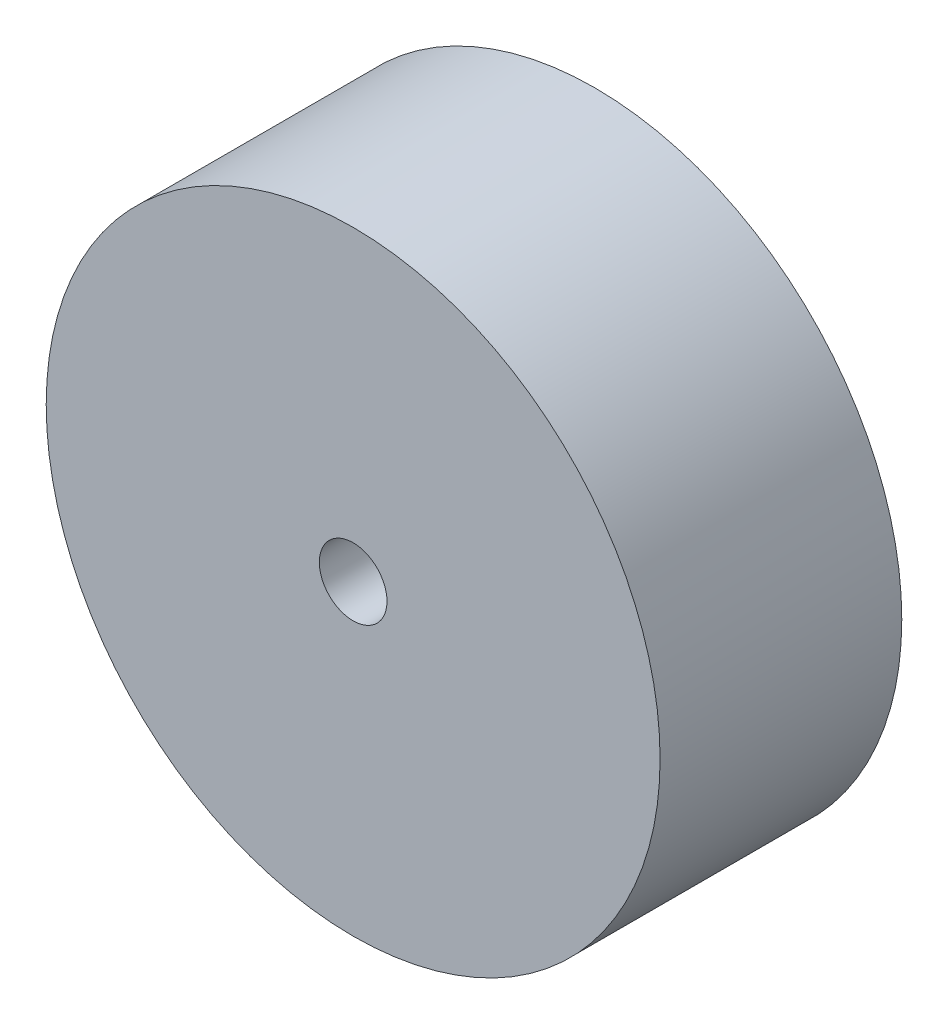
ISO-10303-21;
HEADER;
FILE_DESCRIPTION(('STEP AP214'),'2;1');
FILE_NAME('part.step','',(''),(''),'','','');
FILE_SCHEMA(('AUTOMOTIVE_DESIGN { 1 0 10303 214 1 1 1 1 }'));
ENDSEC;
DATA;
#1=APPLICATION_CONTEXT('core data for automotive mechanical design processes');
#2=APPLICATION_PROTOCOL_DEFINITION('international standard','automotive_design',2000,#1);
#3=PRODUCT_CONTEXT('',#1,'mechanical');
#4=PRODUCT('Part','Part','',(#3));
#5=PRODUCT_RELATED_PRODUCT_CATEGORY('part','',(#4));
#6=PRODUCT_DEFINITION_FORMATION('','',#4);
#7=PRODUCT_DEFINITION_CONTEXT('part definition',#1,'design');
#8=PRODUCT_DEFINITION('design','',#6,#7);
#9=PRODUCT_DEFINITION_SHAPE('','',#8);
#10=(LENGTH_UNIT() NAMED_UNIT(*) SI_UNIT(.MILLI.,.METRE.));
#11=(NAMED_UNIT(*) PLANE_ANGLE_UNIT() SI_UNIT($,.RADIAN.));
#12=(NAMED_UNIT(*) SI_UNIT($,.STERADIAN.) SOLID_ANGLE_UNIT());
#13=UNCERTAINTY_MEASURE_WITH_UNIT(LENGTH_MEASURE(1.E-05),#10,'distance_accuracy_value','');
#14=(GEOMETRIC_REPRESENTATION_CONTEXT(3) GLOBAL_UNCERTAINTY_ASSIGNED_CONTEXT((#13)) GLOBAL_UNIT_ASSIGNED_CONTEXT((#10,
#11,#12)) REPRESENTATION_CONTEXT('',''));
#15=CARTESIAN_POINT('',(0.,0.,0.));
#16=DIRECTION('',(0.,0.,1.));
#17=DIRECTION('',(1.,0.,0.));
#18=AXIS2_PLACEMENT_3D('',#15,#16,#17);
#19=CARTESIAN_POINT('',(0.,0.,15.));
#20=DIRECTION('',(0.,0.,-1.));
#21=DIRECTION('',(-1.,0.,0.));
#22=AXIS2_PLACEMENT_3D('',#19,#20,#21);
#23=CYLINDRICAL_SURFACE('',#22,19.05);
#24=CARTESIAN_POINT('',(0.,0.,15.));
#25=DIRECTION('',(0.,0.,1.));
#26=DIRECTION('',(1.,0.,0.));
#27=AXIS2_PLACEMENT_3D('',#24,#25,#26);
#28=CIRCLE('',#27,19.05);
#29=CARTESIAN_POINT('',(19.05,0.,15.));
#30=VERTEX_POINT('',#29);
#31=EDGE_CURVE('E10',#30,#30,#28,.T.);
#32=ORIENTED_EDGE('',*,*,#31,.F.);
#33=EDGE_LOOP('',(#32));
#34=FACE_BOUND('',#33,.T.);
#35=CARTESIAN_POINT('',(0.,0.,0.));
#36=DIRECTION('',(0.,0.,1.));
#37=DIRECTION('',(1.,0.,0.));
#38=AXIS2_PLACEMENT_3D('',#35,#36,#37);
#39=CIRCLE('',#38,19.05);
#40=CARTESIAN_POINT('',(19.05,0.,0.));
#41=VERTEX_POINT('',#40);
#42=EDGE_CURVE('E18',#41,#41,#39,.T.);
#43=ORIENTED_EDGE('',*,*,#42,.T.);
#44=EDGE_LOOP('',(#43));
#45=FACE_BOUND('',#44,.T.);
#46=ADVANCED_FACE('F15',(#34,#45),#23,.T.);
#47=CARTESIAN_POINT('',(0.,0.,15.));
#48=DIRECTION('',(0.,0.,1.));
#49=DIRECTION('',(1.,0.,0.));
#50=AXIS2_PLACEMENT_3D('',#47,#48,#49);
#51=PLANE('',#50);
#52=CARTESIAN_POINT('',(0.,0.,15.));
#53=DIRECTION('',(0.,0.,1.));
#54=DIRECTION('',(1.,0.,0.));
#55=AXIS2_PLACEMENT_3D('',#52,#53,#54);
#56=CIRCLE('',#55,2.1);
#57=CARTESIAN_POINT('',(2.1,0.,15.));
#58=VERTEX_POINT('',#57);
#59=EDGE_CURVE('E29',#58,#58,#56,.T.);
#60=ORIENTED_EDGE('',*,*,#59,.F.);
#61=EDGE_LOOP('',(#60));
#62=FACE_BOUND('',#61,.T.);
#63=ORIENTED_EDGE('',*,*,#31,.T.);
#64=EDGE_LOOP('',(#63));
#65=FACE_BOUND('',#64,.T.);
#66=ADVANCED_FACE('F35',(#62,#65),#51,.T.);
#67=CARTESIAN_POINT('',(0.,0.,0.));
#68=DIRECTION('',(0.,0.,1.));
#69=DIRECTION('',(1.,0.,0.));
#70=AXIS2_PLACEMENT_3D('',#67,#68,#69);
#71=PLANE('',#70);
#72=CARTESIAN_POINT('',(0.,0.,0.));
#73=DIRECTION('',(0.,0.,1.));
#74=DIRECTION('',(1.,0.,0.));
#75=AXIS2_PLACEMENT_3D('',#72,#73,#74);
#76=CIRCLE('',#75,2.1);
#77=CARTESIAN_POINT('',(2.1,0.,0.));
#78=VERTEX_POINT('',#77);
#79=EDGE_CURVE('E25',#78,#78,#76,.T.);
#80=ORIENTED_EDGE('',*,*,#79,.T.);
#81=EDGE_LOOP('',(#80));
#82=FACE_BOUND('',#81,.T.);
#83=ORIENTED_EDGE('',*,*,#42,.F.);
#84=EDGE_LOOP('',(#83));
#85=FACE_BOUND('',#84,.T.);
#86=ADVANCED_FACE('F37',(#82,#85),#71,.F.);
#87=CARTESIAN_POINT('',(0.,0.,15.));
#88=DIRECTION('',(0.,0.,1.));
#89=DIRECTION('',(1.,0.,0.));
#90=AXIS2_PLACEMENT_3D('',#87,#88,#89);
#91=CYLINDRICAL_SURFACE('',#90,2.1);
#92=ORIENTED_EDGE('',*,*,#79,.F.);
#93=EDGE_LOOP('',(#92));
#94=FACE_BOUND('',#93,.T.);
#95=ORIENTED_EDGE('',*,*,#59,.T.);
#96=EDGE_LOOP('',(#95));
#97=FACE_BOUND('',#96,.T.);
#98=ADVANCED_FACE('F33',(#94,#97),#91,.F.);
#99=CLOSED_SHELL('',(#46,#66,#86,#98));
#100=MANIFOLD_SOLID_BREP('B1',#99);
#101=ADVANCED_BREP_SHAPE_REPRESENTATION('',(#18,#100),#14);
#102=SHAPE_DEFINITION_REPRESENTATION(#9,#101);
ENDSEC;
END-ISO-10303-21;
